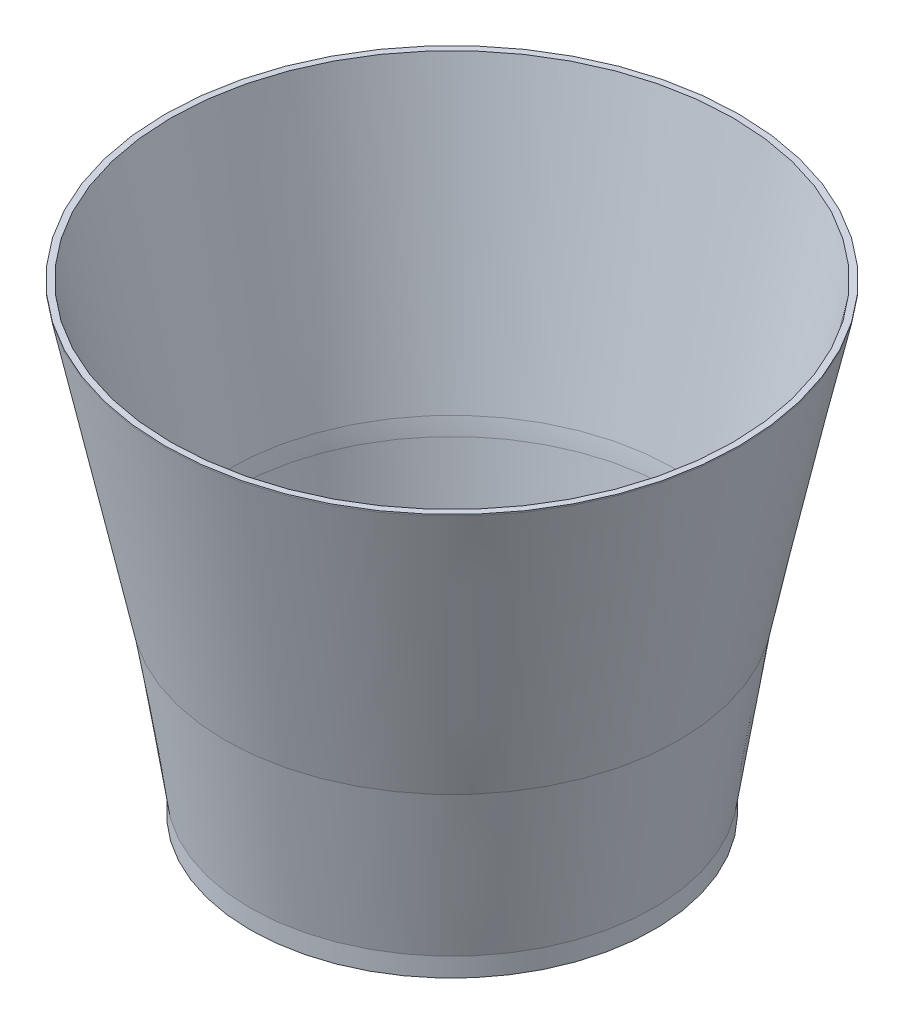
ISO-10303-21;
HEADER;
FILE_DESCRIPTION(('STEP AP214'),'2;1');
FILE_NAME('part.step','',(''),(''),'','','');
FILE_SCHEMA(('AUTOMOTIVE_DESIGN { 1 0 10303 214 1 1 1 1 }'));
ENDSEC;
DATA;
#1=APPLICATION_CONTEXT('core data for automotive mechanical design processes');
#2=APPLICATION_PROTOCOL_DEFINITION('international standard','automotive_design',2000,#1);
#3=PRODUCT_CONTEXT('',#1,'mechanical');
#4=PRODUCT('Part','Part','',(#3));
#5=PRODUCT_RELATED_PRODUCT_CATEGORY('part','',(#4));
#6=PRODUCT_DEFINITION_FORMATION('','',#4);
#7=PRODUCT_DEFINITION_CONTEXT('part definition',#1,'design');
#8=PRODUCT_DEFINITION('design','',#6,#7);
#9=PRODUCT_DEFINITION_SHAPE('','',#8);
#10=(LENGTH_UNIT() NAMED_UNIT(*) SI_UNIT(.MILLI.,.METRE.));
#11=(NAMED_UNIT(*) PLANE_ANGLE_UNIT() SI_UNIT($,.RADIAN.));
#12=(NAMED_UNIT(*) SI_UNIT($,.STERADIAN.) SOLID_ANGLE_UNIT());
#13=UNCERTAINTY_MEASURE_WITH_UNIT(LENGTH_MEASURE(1.E-05),#10,'distance_accuracy_value','');
#14=(GEOMETRIC_REPRESENTATION_CONTEXT(3) GLOBAL_UNCERTAINTY_ASSIGNED_CONTEXT((#13)) GLOBAL_UNIT_ASSIGNED_CONTEXT((#10,
#11,#12)) REPRESENTATION_CONTEXT('',''));
#15=CARTESIAN_POINT('',(0.,0.,0.));
#16=DIRECTION('',(0.,0.,1.));
#17=DIRECTION('',(1.,0.,0.));
#18=AXIS2_PLACEMENT_3D('',#15,#16,#17);
#19=CARTESIAN_POINT('',(0.,3.,0.));
#20=DIRECTION('',(0.,1.,0.));
#21=DIRECTION('',(0.,0.,1.));
#22=AXIS2_PLACEMENT_3D('',#19,#20,#21);
#23=PLANE('',#22);
#24=CARTESIAN_POINT('',(-16.5454319904183,3.,-13.1945417199216));
#25=DIRECTION('',(0.,1.,0.));
#26=DIRECTION('',(0.,0.,1.));
#27=AXIS2_PLACEMENT_3D('',#24,#25,#26);
#28=CIRCLE('',#27,4.00000000000096);
#29=CARTESIAN_POINT('',(-16.5454319904183,3.,-9.19454171992067));
#30=VERTEX_POINT('',#29);
#31=EDGE_CURVE('E97',#30,#30,#28,.T.);
#32=ORIENTED_EDGE('',*,*,#31,.F.);
#33=EDGE_LOOP('',(#32));
#34=FACE_BOUND('',#33,.T.);
#35=CARTESIAN_POINT('',(-9.18202203197914,3.,19.0666652132085));
#36=DIRECTION('',(0.,1.,0.));
#37=DIRECTION('',(0.,0.,1.));
#38=AXIS2_PLACEMENT_3D('',#35,#36,#37);
#39=CIRCLE('',#38,4.00000000000249);
#40=CARTESIAN_POINT('',(-9.18202203197914,3.,23.066665213211));
#41=VERTEX_POINT('',#40);
#42=EDGE_CURVE('E85',#41,#41,#39,.T.);
#43=ORIENTED_EDGE('',*,*,#42,.F.);
#44=EDGE_LOOP('',(#43));
#45=FACE_BOUND('',#44,.T.);
#46=CARTESIAN_POINT('',(20.6318162267481,3.,4.70907741857056));
#47=DIRECTION('',(0.,1.,0.));
#48=DIRECTION('',(0.,0.,1.));
#49=AXIS2_PLACEMENT_3D('',#46,#47,#48);
#50=CIRCLE('',#49,4.00000000000114);
#51=CARTESIAN_POINT('',(20.6318162267481,3.,8.7090774185717));
#52=VERTEX_POINT('',#51);
#53=EDGE_CURVE('E73',#52,#52,#50,.T.);
#54=ORIENTED_EDGE('',*,*,#53,.F.);
#55=EDGE_LOOP('',(#54));
#56=FACE_BOUND('',#55,.T.);
#57=CARTESIAN_POINT('',(0.,3.,-21.1624018237144));
#58=DIRECTION('',(0.,1.,0.));
#59=DIRECTION('',(0.,0.,1.));
#60=AXIS2_PLACEMENT_3D('',#57,#58,#59);
#61=CIRCLE('',#60,4.);
#62=CARTESIAN_POINT('',(0.,3.,-17.1624018237144));
#63=VERTEX_POINT('',#62);
#64=EDGE_CURVE('E61',#63,#63,#61,.T.);
#65=ORIENTED_EDGE('',*,*,#64,.F.);
#66=EDGE_LOOP('',(#65));
#67=FACE_BOUND('',#66,.T.);
#68=CARTESIAN_POINT('',(0.,3.,-9.99999999999992));
#69=DIRECTION('',(0.,1.,0.));
#70=DIRECTION('',(0.,0.,1.));
#71=AXIS2_PLACEMENT_3D('',#68,#69,#70);
#72=CIRCLE('',#71,2.);
#73=CARTESIAN_POINT('',(0.,3.,-7.99999999999992));
#74=VERTEX_POINT('',#73);
#75=EDGE_CURVE('E50',#74,#74,#72,.T.);
#76=ORIENTED_EDGE('',*,*,#75,.F.);
#77=EDGE_LOOP('',(#76));
#78=FACE_BOUND('',#77,.T.);
#79=CARTESIAN_POINT('',(0.,3.,5.0000000000001));
#80=DIRECTION('',(0.,1.,0.));
#81=DIRECTION('',(0.,0.,1.));
#82=AXIS2_PLACEMENT_3D('',#79,#80,#81);
#83=CIRCLE('',#82,2.);
#84=CARTESIAN_POINT('',(0.,3.,7.0000000000001));
#85=VERTEX_POINT('',#84);
#86=EDGE_CURVE('E55',#85,#85,#83,.T.);
#87=ORIENTED_EDGE('',*,*,#86,.F.);
#88=EDGE_LOOP('',(#87));
#89=FACE_BOUND('',#88,.T.);
#90=CARTESIAN_POINT('',(16.5454319904192,3.,-13.1945417199235));
#91=DIRECTION('',(0.,1.,0.));
#92=DIRECTION('',(0.,0.,1.));
#93=AXIS2_PLACEMENT_3D('',#90,#91,#92);
#94=CIRCLE('',#93,4.0000000000002);
#95=CARTESIAN_POINT('',(16.5454319904192,3.,-9.19454171992332));
#96=VERTEX_POINT('',#95);
#97=EDGE_CURVE('E67',#96,#96,#94,.T.);
#98=ORIENTED_EDGE('',*,*,#97,.F.);
#99=EDGE_LOOP('',(#98));
#100=FACE_BOUND('',#99,.T.);
#101=CARTESIAN_POINT('',(9.1820220319837,3.,19.0666652132075));
#102=DIRECTION('',(0.,1.,0.));
#103=DIRECTION('',(0.,0.,1.));
#104=AXIS2_PLACEMENT_3D('',#101,#102,#103);
#105=CIRCLE('',#104,4.00000000000216);
#106=CARTESIAN_POINT('',(9.1820220319837,3.,23.0666652132097));
#107=VERTEX_POINT('',#106);
#108=EDGE_CURVE('E79',#107,#107,#105,.T.);
#109=ORIENTED_EDGE('',*,*,#108,.F.);
#110=EDGE_LOOP('',(#109));
#111=FACE_BOUND('',#110,.T.);
#112=CARTESIAN_POINT('',(-20.6318162267452,3.,4.7090774185729));
#113=DIRECTION('',(0.,1.,0.));
#114=DIRECTION('',(0.,0.,1.));
#115=AXIS2_PLACEMENT_3D('',#112,#113,#114);
#116=CIRCLE('',#115,4.00000000000194);
#117=CARTESIAN_POINT('',(-20.6318162267452,3.,8.70907741857485));
#118=VERTEX_POINT('',#117);
#119=EDGE_CURVE('E91',#118,#118,#116,.T.);
#120=ORIENTED_EDGE('',*,*,#119,.F.);
#121=EDGE_LOOP('',(#120));
#122=FACE_BOUND('',#121,.T.);
#123=CARTESIAN_POINT('',(0.,3.,0.));
#124=DIRECTION('',(0.,1.,0.));
#125=DIRECTION('',(0.,0.,1.));
#126=AXIS2_PLACEMENT_3D('',#123,#124,#125);
#127=CIRCLE('',#126,31.);
#128=CARTESIAN_POINT('',(0.,3.,31.));
#129=VERTEX_POINT('',#128);
#130=EDGE_CURVE('E103',#129,#129,#127,.T.);
#131=ORIENTED_EDGE('',*,*,#130,.T.);
#132=EDGE_LOOP('',(#131));
#133=FACE_BOUND('',#132,.T.);
#134=ADVANCED_FACE('F31',(#34,#45,#56,#67,#78,#89,#100,#111,#122,#133),#23,.T.);
#135=CARTESIAN_POINT('',(0.,0.,0.));
#136=DIRECTION('',(0.,1.,0.));
#137=DIRECTION('',(0.,0.,1.));
#138=AXIS2_PLACEMENT_3D('',#135,#136,#137);
#139=PLANE('',#138);
#140=CARTESIAN_POINT('',(0.,0.,0.));
#141=DIRECTION('',(0.,1.,0.));
#142=DIRECTION('',(0.,0.,1.));
#143=AXIS2_PLACEMENT_3D('',#140,#141,#142);
#144=CIRCLE('',#143,32.);
#145=CARTESIAN_POINT('',(0.,0.,32.));
#146=VERTEX_POINT('',#145);
#147=EDGE_CURVE('E46',#146,#146,#144,.T.);
#148=ORIENTED_EDGE('',*,*,#147,.F.);
#149=EDGE_LOOP('',(#148));
#150=FACE_BOUND('',#149,.T.);
#151=CARTESIAN_POINT('',(-16.5454319904183,0.,-13.1945417199216));
#152=DIRECTION('',(0.,1.,0.));
#153=DIRECTION('',(0.,0.,1.));
#154=AXIS2_PLACEMENT_3D('',#151,#152,#153);
#155=CIRCLE('',#154,4.00000000000096);
#156=CARTESIAN_POINT('',(-16.5454319904183,0.,-9.19454171992067));
#157=VERTEX_POINT('',#156);
#158=EDGE_CURVE('E100',#157,#157,#155,.T.);
#159=ORIENTED_EDGE('',*,*,#158,.T.);
#160=EDGE_LOOP('',(#159));
#161=FACE_BOUND('',#160,.T.);
#162=CARTESIAN_POINT('',(-20.6318162267452,0.,4.7090774185729));
#163=DIRECTION('',(0.,1.,0.));
#164=DIRECTION('',(0.,0.,1.));
#165=AXIS2_PLACEMENT_3D('',#162,#163,#164);
#166=CIRCLE('',#165,4.00000000000194);
#167=CARTESIAN_POINT('',(-20.6318162267452,0.,8.70907741857485));
#168=VERTEX_POINT('',#167);
#169=EDGE_CURVE('E94',#168,#168,#166,.T.);
#170=ORIENTED_EDGE('',*,*,#169,.T.);
#171=EDGE_LOOP('',(#170));
#172=FACE_BOUND('',#171,.T.);
#173=CARTESIAN_POINT('',(-9.18202203197914,0.,19.0666652132085));
#174=DIRECTION('',(0.,1.,0.));
#175=DIRECTION('',(0.,0.,1.));
#176=AXIS2_PLACEMENT_3D('',#173,#174,#175);
#177=CIRCLE('',#176,4.00000000000249);
#178=CARTESIAN_POINT('',(-9.18202203197914,0.,23.066665213211));
#179=VERTEX_POINT('',#178);
#180=EDGE_CURVE('E88',#179,#179,#177,.T.);
#181=ORIENTED_EDGE('',*,*,#180,.T.);
#182=EDGE_LOOP('',(#181));
#183=FACE_BOUND('',#182,.T.);
#184=CARTESIAN_POINT('',(9.1820220319837,0.,19.0666652132075));
#185=DIRECTION('',(0.,1.,0.));
#186=DIRECTION('',(0.,0.,1.));
#187=AXIS2_PLACEMENT_3D('',#184,#185,#186);
#188=CIRCLE('',#187,4.00000000000216);
#189=CARTESIAN_POINT('',(9.1820220319837,0.,23.0666652132097));
#190=VERTEX_POINT('',#189);
#191=EDGE_CURVE('E82',#190,#190,#188,.T.);
#192=ORIENTED_EDGE('',*,*,#191,.T.);
#193=EDGE_LOOP('',(#192));
#194=FACE_BOUND('',#193,.T.);
#195=CARTESIAN_POINT('',(20.6318162267481,0.,4.70907741857056));
#196=DIRECTION('',(0.,1.,0.));
#197=DIRECTION('',(0.,0.,1.));
#198=AXIS2_PLACEMENT_3D('',#195,#196,#197);
#199=CIRCLE('',#198,4.00000000000114);
#200=CARTESIAN_POINT('',(20.6318162267481,0.,8.7090774185717));
#201=VERTEX_POINT('',#200);
#202=EDGE_CURVE('E76',#201,#201,#199,.T.);
#203=ORIENTED_EDGE('',*,*,#202,.T.);
#204=EDGE_LOOP('',(#203));
#205=FACE_BOUND('',#204,.T.);
#206=CARTESIAN_POINT('',(16.5454319904192,0.,-13.1945417199235));
#207=DIRECTION('',(0.,1.,0.));
#208=DIRECTION('',(0.,0.,1.));
#209=AXIS2_PLACEMENT_3D('',#206,#207,#208);
#210=CIRCLE('',#209,4.0000000000002);
#211=CARTESIAN_POINT('',(16.5454319904192,0.,-9.19454171992332));
#212=VERTEX_POINT('',#211);
#213=EDGE_CURVE('E70',#212,#212,#210,.T.);
#214=ORIENTED_EDGE('',*,*,#213,.T.);
#215=EDGE_LOOP('',(#214));
#216=FACE_BOUND('',#215,.T.);
#217=CARTESIAN_POINT('',(0.,0.,-21.1624018237144));
#218=DIRECTION('',(0.,1.,0.));
#219=DIRECTION('',(0.,0.,1.));
#220=AXIS2_PLACEMENT_3D('',#217,#218,#219);
#221=CIRCLE('',#220,4.);
#222=CARTESIAN_POINT('',(0.,0.,-17.1624018237144));
#223=VERTEX_POINT('',#222);
#224=EDGE_CURVE('E64',#223,#223,#221,.T.);
#225=ORIENTED_EDGE('',*,*,#224,.T.);
#226=EDGE_LOOP('',(#225));
#227=FACE_BOUND('',#226,.T.);
#228=CARTESIAN_POINT('',(0.,0.,5.0000000000001));
#229=DIRECTION('',(0.,1.,0.));
#230=DIRECTION('',(0.,0.,1.));
#231=AXIS2_PLACEMENT_3D('',#228,#229,#230);
#232=CIRCLE('',#231,2.);
#233=CARTESIAN_POINT('',(0.,0.,7.0000000000001));
#234=VERTEX_POINT('',#233);
#235=EDGE_CURVE('E58',#234,#234,#232,.T.);
#236=ORIENTED_EDGE('',*,*,#235,.T.);
#237=EDGE_LOOP('',(#236));
#238=FACE_BOUND('',#237,.T.);
#239=CARTESIAN_POINT('',(0.,0.,-9.99999999999992));
#240=DIRECTION('',(0.,1.,0.));
#241=DIRECTION('',(0.,0.,1.));
#242=AXIS2_PLACEMENT_3D('',#239,#240,#241);
#243=CIRCLE('',#242,2.);
#244=CARTESIAN_POINT('',(0.,0.,-7.99999999999992));
#245=VERTEX_POINT('',#244);
#246=EDGE_CURVE('E52',#245,#245,#243,.T.);
#247=ORIENTED_EDGE('',*,*,#246,.T.);
#248=EDGE_LOOP('',(#247));
#249=FACE_BOUND('',#248,.T.);
#250=ADVANCED_FACE('F135',(#150,#161,#172,#183,#194,#205,#216,#227,#238,#249),#139,.F.);
#251=CARTESIAN_POINT('',(0.,3.,0.));
#252=DIRECTION('',(0.,-1.,0.));
#253=DIRECTION('',(0.,0.,-1.));
#254=AXIS2_PLACEMENT_3D('',#251,#252,#253);
#255=CYLINDRICAL_SURFACE('',#254,32.);
#256=CARTESIAN_POINT('',(0.,3.,0.));
#257=DIRECTION('',(0.,1.,0.));
#258=DIRECTION('',(0.,0.,1.));
#259=AXIS2_PLACEMENT_3D('',#256,#257,#258);
#260=CIRCLE('',#259,32.);
#261=CARTESIAN_POINT('',(0.,3.,32.));
#262=VERTEX_POINT('',#261);
#263=EDGE_CURVE('E42',#262,#262,#260,.T.);
#264=ORIENTED_EDGE('',*,*,#263,.F.);
#265=EDGE_LOOP('',(#264));
#266=FACE_BOUND('',#265,.T.);
#267=ORIENTED_EDGE('',*,*,#147,.T.);
#268=EDGE_LOOP('',(#267));
#269=FACE_BOUND('',#268,.T.);
#270=ADVANCED_FACE('F141',(#266,#269),#255,.T.);
#271=CARTESIAN_POINT('',(0.,3.,-9.99999999999992));
#272=DIRECTION('',(0.,-1.,0.));
#273=DIRECTION('',(0.,0.,-1.));
#274=AXIS2_PLACEMENT_3D('',#271,#272,#273);
#275=CYLINDRICAL_SURFACE('',#274,2.);
#276=ORIENTED_EDGE('',*,*,#75,.T.);
#277=EDGE_LOOP('',(#276));
#278=FACE_BOUND('',#277,.T.);
#279=ORIENTED_EDGE('',*,*,#246,.F.);
#280=EDGE_LOOP('',(#279));
#281=FACE_BOUND('',#280,.T.);
#282=ADVANCED_FACE('F147',(#278,#281),#275,.F.);
#283=CARTESIAN_POINT('',(0.,3.,5.0000000000001));
#284=DIRECTION('',(0.,-1.,0.));
#285=DIRECTION('',(0.,0.,-1.));
#286=AXIS2_PLACEMENT_3D('',#283,#284,#285);
#287=CYLINDRICAL_SURFACE('',#286,2.);
#288=ORIENTED_EDGE('',*,*,#86,.T.);
#289=EDGE_LOOP('',(#288));
#290=FACE_BOUND('',#289,.T.);
#291=ORIENTED_EDGE('',*,*,#235,.F.);
#292=EDGE_LOOP('',(#291));
#293=FACE_BOUND('',#292,.T.);
#294=ADVANCED_FACE('F154',(#290,#293),#287,.F.);
#295=CARTESIAN_POINT('',(0.,3.,-21.1624018237144));
#296=DIRECTION('',(0.,-1.,0.));
#297=DIRECTION('',(0.,0.,-1.));
#298=AXIS2_PLACEMENT_3D('',#295,#296,#297);
#299=CYLINDRICAL_SURFACE('',#298,4.);
#300=ORIENTED_EDGE('',*,*,#64,.T.);
#301=EDGE_LOOP('',(#300));
#302=FACE_BOUND('',#301,.T.);
#303=ORIENTED_EDGE('',*,*,#224,.F.);
#304=EDGE_LOOP('',(#303));
#305=FACE_BOUND('',#304,.T.);
#306=ADVANCED_FACE('F180',(#302,#305),#299,.F.);
#307=CARTESIAN_POINT('',(16.5454319904192,3.,-13.1945417199235));
#308=DIRECTION('',(0.,-1.,0.));
#309=DIRECTION('',(0.,0.,-1.));
#310=AXIS2_PLACEMENT_3D('',#307,#308,#309);
#311=CYLINDRICAL_SURFACE('',#310,4.0000000000002);
#312=ORIENTED_EDGE('',*,*,#97,.T.);
#313=EDGE_LOOP('',(#312));
#314=FACE_BOUND('',#313,.T.);
#315=ORIENTED_EDGE('',*,*,#213,.F.);
#316=EDGE_LOOP('',(#315));
#317=FACE_BOUND('',#316,.T.);
#318=ADVANCED_FACE('F185',(#314,#317),#311,.F.);
#319=CARTESIAN_POINT('',(20.6318162267481,3.,4.70907741857056));
#320=DIRECTION('',(0.,-1.,0.));
#321=DIRECTION('',(0.,0.,-1.));
#322=AXIS2_PLACEMENT_3D('',#319,#320,#321);
#323=CYLINDRICAL_SURFACE('',#322,4.00000000000114);
#324=ORIENTED_EDGE('',*,*,#53,.T.);
#325=EDGE_LOOP('',(#324));
#326=FACE_BOUND('',#325,.T.);
#327=ORIENTED_EDGE('',*,*,#202,.F.);
#328=EDGE_LOOP('',(#327));
#329=FACE_BOUND('',#328,.T.);
#330=ADVANCED_FACE('F191',(#326,#329),#323,.F.);
#331=CARTESIAN_POINT('',(9.1820220319837,3.,19.0666652132075));
#332=DIRECTION('',(0.,-1.,0.));
#333=DIRECTION('',(0.,0.,-1.));
#334=AXIS2_PLACEMENT_3D('',#331,#332,#333);
#335=CYLINDRICAL_SURFACE('',#334,4.00000000000216);
#336=ORIENTED_EDGE('',*,*,#108,.T.);
#337=EDGE_LOOP('',(#336));
#338=FACE_BOUND('',#337,.T.);
#339=ORIENTED_EDGE('',*,*,#191,.F.);
#340=EDGE_LOOP('',(#339));
#341=FACE_BOUND('',#340,.T.);
#342=ADVANCED_FACE('F195',(#338,#341),#335,.F.);
#343=CARTESIAN_POINT('',(-9.18202203197914,3.,19.0666652132085));
#344=DIRECTION('',(0.,-1.,0.));
#345=DIRECTION('',(0.,0.,-1.));
#346=AXIS2_PLACEMENT_3D('',#343,#344,#345);
#347=CYLINDRICAL_SURFACE('',#346,4.00000000000249);
#348=ORIENTED_EDGE('',*,*,#42,.T.);
#349=EDGE_LOOP('',(#348));
#350=FACE_BOUND('',#349,.T.);
#351=ORIENTED_EDGE('',*,*,#180,.F.);
#352=EDGE_LOOP('',(#351));
#353=FACE_BOUND('',#352,.T.);
#354=ADVANCED_FACE('F199',(#350,#353),#347,.F.);
#355=CARTESIAN_POINT('',(-20.6318162267452,3.,4.7090774185729));
#356=DIRECTION('',(0.,-1.,0.));
#357=DIRECTION('',(0.,0.,-1.));
#358=AXIS2_PLACEMENT_3D('',#355,#356,#357);
#359=CYLINDRICAL_SURFACE('',#358,4.00000000000194);
#360=ORIENTED_EDGE('',*,*,#119,.T.);
#361=EDGE_LOOP('',(#360));
#362=FACE_BOUND('',#361,.T.);
#363=ORIENTED_EDGE('',*,*,#169,.F.);
#364=EDGE_LOOP('',(#363));
#365=FACE_BOUND('',#364,.T.);
#366=ADVANCED_FACE('F203',(#362,#365),#359,.F.);
#367=CARTESIAN_POINT('',(-16.5454319904183,3.,-13.1945417199216));
#368=DIRECTION('',(0.,-1.,0.));
#369=DIRECTION('',(0.,0.,-1.));
#370=AXIS2_PLACEMENT_3D('',#367,#368,#369);
#371=CYLINDRICAL_SURFACE('',#370,4.00000000000096);
#372=ORIENTED_EDGE('',*,*,#31,.T.);
#373=EDGE_LOOP('',(#372));
#374=FACE_BOUND('',#373,.T.);
#375=ORIENTED_EDGE('',*,*,#158,.F.);
#376=EDGE_LOOP('',(#375));
#377=FACE_BOUND('',#376,.T.);
#378=ADVANCED_FACE('F207',(#374,#377),#371,.F.);
#379=CARTESIAN_POINT('',(0.,28.,0.));
#380=DIRECTION('',(0.,1.,0.));
#381=DIRECTION('',(0.,0.,1.));
#382=AXIS2_PLACEMENT_3D('',#379,#380,#381);
#383=CONICAL_SURFACE('',#382,35.9596110081133,0.157079632679486);
#384=ORIENTED_EDGE('',*,*,#263,.T.);
#385=EDGE_LOOP('',(#384));
#386=FACE_BOUND('',#385,.T.);
#387=CARTESIAN_POINT('',(0.,28.,0.));
#388=DIRECTION('',(0.,-1.,0.));
#389=DIRECTION('',(0.,0.,-1.));
#390=AXIS2_PLACEMENT_3D('',#387,#388,#389);
#391=CIRCLE('',#390,35.9596110081133);
#392=CARTESIAN_POINT('',(0.,28.,-35.9596110081133));
#393=VERTEX_POINT('',#392);
#394=EDGE_CURVE('E108',#393,#393,#391,.T.);
#395=ORIENTED_EDGE('',*,*,#394,.T.);
#396=EDGE_LOOP('',(#395));
#397=FACE_BOUND('',#396,.T.);
#398=ADVANCED_FACE('F211',(#386,#397),#383,.T.);
#399=CARTESIAN_POINT('',(0.,0.,0.));
#400=DIRECTION('',(0.,1.,0.));
#401=DIRECTION('',(0.,0.,1.));
#402=AXIS2_PLACEMENT_3D('',#399,#400,#401);
#403=CONICAL_SURFACE('',#402,30.5248466790264,0.157079632679486);
#404=CARTESIAN_POINT('',(0.,27.1192237508437,0.));
#405=DIRECTION('',(0.,-1.,0.));
#406=DIRECTION('',(0.,0.,-1.));
#407=AXIS2_PLACEMENT_3D('',#404,#405,#406);
#408=CIRCLE('',#407,34.8201097548396);
#409=CARTESIAN_POINT('',(0.,27.1192237508437,-34.8201097548396));
#410=VERTEX_POINT('',#409);
#411=EDGE_CURVE('E10',#410,#410,#408,.F.);
#412=ORIENTED_EDGE('',*,*,#411,.T.);
#413=EDGE_LOOP('',(#412));
#414=FACE_BOUND('',#413,.T.);
#415=ORIENTED_EDGE('',*,*,#130,.F.);
#416=EDGE_LOOP('',(#415));
#417=FACE_BOUND('',#416,.T.);
#418=ADVANCED_FACE('F215',(#414,#417),#403,.F.);
#419=CARTESIAN_POINT('',(0.,73.,0.));
#420=DIRECTION('',(0.,1.,0.));
#421=DIRECTION('',(0.,0.,1.));
#422=AXIS2_PLACEMENT_3D('',#419,#420,#421);
#423=CONICAL_SURFACE('',#422,45.5246562832642,0.209439510239317);
#424=ORIENTED_EDGE('',*,*,#394,.F.);
#425=EDGE_LOOP('',(#424));
#426=FACE_BOUND('',#425,.T.);
#427=CARTESIAN_POINT('',(0.,73.,0.));
#428=DIRECTION('',(0.,-1.,0.));
#429=DIRECTION('',(0.,0.,-1.));
#430=AXIS2_PLACEMENT_3D('',#427,#428,#429);
#431=CIRCLE('',#430,45.5246562832642);
#432=CARTESIAN_POINT('',(0.,73.,-45.5246562832642));
#433=VERTEX_POINT('',#432);
#434=EDGE_CURVE('E111',#433,#433,#431,.T.);
#435=ORIENTED_EDGE('',*,*,#434,.T.);
#436=EDGE_LOOP('',(#435));
#437=FACE_BOUND('',#436,.T.);
#438=ADVANCED_FACE('F219',(#426,#437),#423,.T.);
#439=CARTESIAN_POINT('',(0.,0.,0.));
#440=DIRECTION('',(0.,-1.,0.));
#441=DIRECTION('',(0.,0.,-1.));
#442=AXIS2_PLACEMENT_3D('',#439,#440,#441);
#443=CYLINDRICAL_SURFACE('',#442,45.5246562832642);
#444=ORIENTED_EDGE('',*,*,#434,.F.);
#445=EDGE_LOOP('',(#444));
#446=FACE_BOUND('',#445,.T.);
#447=CARTESIAN_POINT('',(0.,73.2079116908178,0.));
#448=DIRECTION('',(0.,-1.,0.));
#449=DIRECTION('',(0.,0.,-1.));
#450=AXIS2_PLACEMENT_3D('',#447,#448,#449);
#451=CIRCLE('',#450,45.5246562832642);
#452=CARTESIAN_POINT('',(0.,73.2079116908178,-45.5246562832642));
#453=VERTEX_POINT('',#452);
#454=EDGE_CURVE('E114',#453,#453,#451,.T.);
#455=ORIENTED_EDGE('',*,*,#454,.T.);
#456=EDGE_LOOP('',(#455));
#457=FACE_BOUND('',#456,.T.);
#458=ADVANCED_FACE('F131',(#446,#457),#443,.T.);
#459=CARTESIAN_POINT('',(0.,73.2079116908178,44.5465086825304));
#460=DIRECTION('',(0.,-1.,0.));
#461=DIRECTION('',(0.,0.,-1.));
#462=AXIS2_PLACEMENT_3D('',#459,#460,#461);
#463=PLANE('',#462);
#464=ORIENTED_EDGE('',*,*,#454,.F.);
#465=EDGE_LOOP('',(#464));
#466=FACE_BOUND('',#465,.T.);
#467=CARTESIAN_POINT('',(0.,73.2079116908178,0.));
#468=DIRECTION('',(0.,-1.,0.));
#469=DIRECTION('',(0.,0.,-1.));
#470=AXIS2_PLACEMENT_3D('',#467,#468,#469);
#471=CIRCLE('',#470,44.5465086825304);
#472=CARTESIAN_POINT('',(0.,73.2079116908178,-44.5465086825304));
#473=VERTEX_POINT('',#472);
#474=EDGE_CURVE('E117',#473,#473,#471,.T.);
#475=ORIENTED_EDGE('',*,*,#474,.T.);
#476=EDGE_LOOP('',(#475));
#477=FACE_BOUND('',#476,.T.);
#478=ADVANCED_FACE('F121',(#466,#477),#463,.F.);
#479=CARTESIAN_POINT('',(0.,28.2079116908178,0.));
#480=DIRECTION('',(0.,1.,0.));
#481=DIRECTION('',(0.,0.,1.));
#482=AXIS2_PLACEMENT_3D('',#479,#480,#481);
#483=CONICAL_SURFACE('',#482,34.9814634073795,0.209439510239317);
#484=CARTESIAN_POINT('',(0.,29.6930850397202,0.));
#485=DIRECTION('',(0.,-1.,0.));
#486=DIRECTION('',(0.,0.,-1.));
#487=AXIS2_PLACEMENT_3D('',#484,#485,#486);
#488=CIRCLE('',#487,35.2971467479062);
#489=CARTESIAN_POINT('',(0.,29.6930850397202,-35.2971467479062));
#490=VERTEX_POINT('',#489);
#491=EDGE_CURVE('E38',#490,#490,#488,.T.);
#492=ORIENTED_EDGE('',*,*,#491,.T.);
#493=EDGE_LOOP('',(#492));
#494=FACE_BOUND('',#493,.T.);
#495=ORIENTED_EDGE('',*,*,#474,.F.);
#496=EDGE_LOOP('',(#495));
#497=FACE_BOUND('',#496,.T.);
#498=ADVANCED_FACE('F123',(#494,#497),#483,.F.);
#499=CARTESIAN_POINT('',(0.,19.2975004988323,0.));
#500=DIRECTION('',(0.,1.,0.));
#501=DIRECTION('',(0.,0.,1.));
#502=AXIS2_PLACEMENT_3D('',#499,#500,#501);
#503=TOROIDAL_SURFACE('',#502,84.2045267845965,50.);
#504=ORIENTED_EDGE('',*,*,#411,.F.);
#505=EDGE_LOOP('',(#504));
#506=FACE_BOUND('',#505,.T.);
#507=ORIENTED_EDGE('',*,*,#491,.F.);
#508=EDGE_LOOP('',(#507));
#509=FACE_BOUND('',#508,.T.);
#510=ADVANCED_FACE('F33',(#506,#509),#503,.T.);
#511=CLOSED_SHELL('',(#134,#250,#270,#282,#294,#306,#318,#330,#342,#354,#366,#378,#398,#418,
#438,#458,#478,#498,#510));
#512=MANIFOLD_SOLID_BREP('B2',#511);
#513=ADVANCED_BREP_SHAPE_REPRESENTATION('',(#18,#512),#14);
#514=SHAPE_DEFINITION_REPRESENTATION(#9,#513);
ENDSEC;
END-ISO-10303-21;
